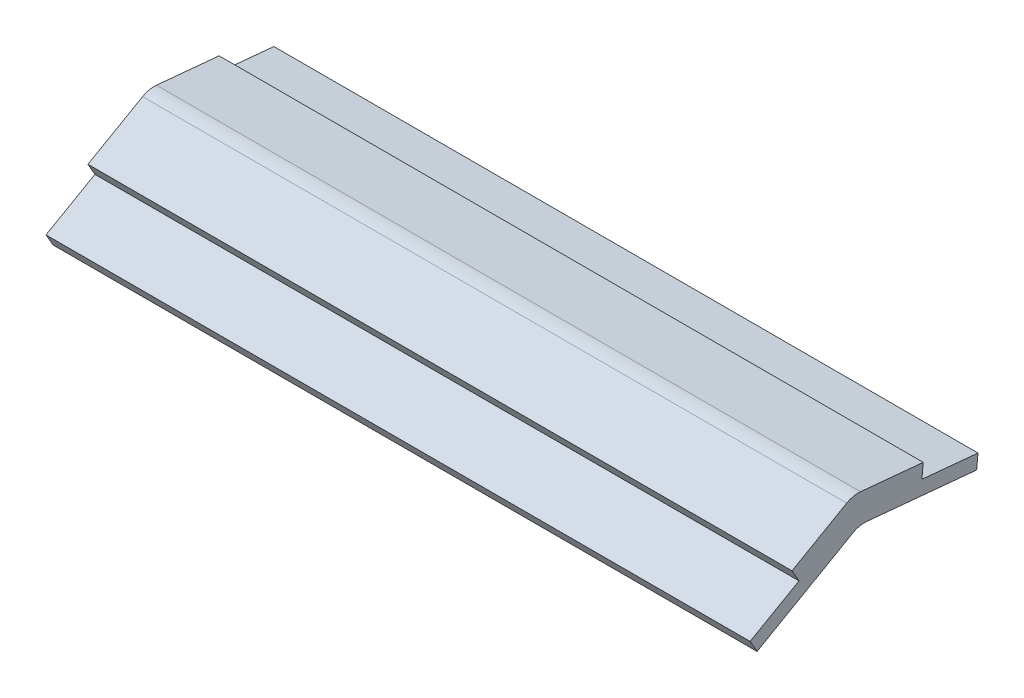
ISO-10303-21;
HEADER;
FILE_DESCRIPTION(('STEP AP214'),'2;1');
FILE_NAME('part.step','',(''),(''),'','','');
FILE_SCHEMA(('AUTOMOTIVE_DESIGN { 1 0 10303 214 1 1 1 1 }'));
ENDSEC;
DATA;
#1=APPLICATION_CONTEXT('core data for automotive mechanical design processes');
#2=APPLICATION_PROTOCOL_DEFINITION('international standard','automotive_design',2000,#1);
#3=PRODUCT_CONTEXT('',#1,'mechanical');
#4=PRODUCT('Part','Part','',(#3));
#5=PRODUCT_RELATED_PRODUCT_CATEGORY('part','',(#4));
#6=PRODUCT_DEFINITION_FORMATION('','',#4);
#7=PRODUCT_DEFINITION_CONTEXT('part definition',#1,'design');
#8=PRODUCT_DEFINITION('design','',#6,#7);
#9=PRODUCT_DEFINITION_SHAPE('','',#8);
#10=(LENGTH_UNIT() NAMED_UNIT(*) SI_UNIT(.MILLI.,.METRE.));
#11=(NAMED_UNIT(*) PLANE_ANGLE_UNIT() SI_UNIT($,.RADIAN.));
#12=(NAMED_UNIT(*) SI_UNIT($,.STERADIAN.) SOLID_ANGLE_UNIT());
#13=UNCERTAINTY_MEASURE_WITH_UNIT(LENGTH_MEASURE(1.E-05),#10,'distance_accuracy_value','');
#14=(GEOMETRIC_REPRESENTATION_CONTEXT(3) GLOBAL_UNCERTAINTY_ASSIGNED_CONTEXT((#13)) GLOBAL_UNIT_ASSIGNED_CONTEXT((#10,
#11,#12)) REPRESENTATION_CONTEXT('',''));
#15=CARTESIAN_POINT('',(0.,0.,0.));
#16=DIRECTION('',(0.,0.,1.));
#17=DIRECTION('',(1.,0.,0.));
#18=AXIS2_PLACEMENT_3D('',#15,#16,#17);
#19=CARTESIAN_POINT('',(150.,11.1634750678157,17.0367707480684));
#20=DIRECTION('',(0.,-0.868219876699294,-0.496179650634991));
#21=DIRECTION('',(0.,0.496179650634991,-0.868219876699294));
#22=AXIS2_PLACEMENT_3D('',#19,#20,#21);
#23=PLANE('',#22);
#24=DIRECTION('',(0.,-0.496179650634991,0.868219876699294));
#25=VECTOR('',#24,1.);
#26=CARTESIAN_POINT('',(0.,11.1634750678157,17.0367707480684));
#27=LINE('',#26,#25);
#28=CARTESIAN_POINT('',(0.,17.8204229852175,5.38837990285019));
#29=VERTEX_POINT('',#28);
#30=CARTESIAN_POINT('',(0.,11.1634750678157,17.0367707480684));
#31=VERTEX_POINT('',#30);
#32=EDGE_CURVE('E164',#29,#31,#27,.T.);
#33=ORIENTED_EDGE('',*,*,#32,.T.);
#34=DIRECTION('',(-1.,0.,0.));
#35=VECTOR('',#34,1.);
#36=CARTESIAN_POINT('',(150.,11.1634750678157,17.0367707480684));
#37=LINE('',#36,#35);
#38=CARTESIAN_POINT('',(150.,11.1634750678157,17.0367707480684));
#39=VERTEX_POINT('',#38);
#40=EDGE_CURVE('E11',#39,#31,#37,.T.);
#41=ORIENTED_EDGE('',*,*,#40,.F.);
#42=DIRECTION('',(0.,-0.496179650634991,0.868219876699294));
#43=VECTOR('',#42,1.);
#44=CARTESIAN_POINT('',(150.,11.1634750678157,17.0367707480684));
#45=LINE('',#44,#43);
#46=CARTESIAN_POINT('',(150.,17.8204229852175,5.38837990285019));
#47=VERTEX_POINT('',#46);
#48=EDGE_CURVE('E198',#47,#39,#45,.T.);
#49=ORIENTED_EDGE('',*,*,#48,.F.);
#50=DIRECTION('',(-1.,0.,0.));
#51=VECTOR('',#50,1.);
#52=CARTESIAN_POINT('',(150.,17.8204229852175,5.38837990285019));
#53=LINE('',#52,#51);
#54=EDGE_CURVE('E160',#47,#29,#53,.T.);
#55=ORIENTED_EDGE('',*,*,#54,.T.);
#56=EDGE_LOOP('',(#33,#41,#49,#55));
#57=FACE_BOUND('',#56,.T.);
#58=ADVANCED_FACE('F39',(#57),#23,.F.);
#59=CARTESIAN_POINT('',(150.,11.1634750678157,17.0367707480684));
#60=DIRECTION('',(0.,0.496179650634992,-0.868219876699294));
#61=DIRECTION('',(0.,0.868219876699294,0.496179650634992));
#62=AXIS2_PLACEMENT_3D('',#59,#60,#61);
#63=PLANE('',#62);
#64=DIRECTION('',(0.,-0.868219876699294,-0.496179650634992));
#65=VECTOR('',#64,1.);
#66=CARTESIAN_POINT('',(0.,11.1634750678157,17.0367707480684));
#67=LINE('',#66,#65);
#68=CARTESIAN_POINT('',(0.,8.55881543771778,15.5482317961635));
#69=VERTEX_POINT('',#68);
#70=EDGE_CURVE('E168',#31,#69,#67,.T.);
#71=ORIENTED_EDGE('',*,*,#70,.T.);
#72=DIRECTION('',(-1.,0.,0.));
#73=VECTOR('',#72,1.);
#74=CARTESIAN_POINT('',(150.,8.55881543771778,15.5482317961635));
#75=LINE('',#74,#73);
#76=CARTESIAN_POINT('',(150.,8.55881543771778,15.5482317961635));
#77=VERTEX_POINT('',#76);
#78=EDGE_CURVE('E48',#77,#69,#75,.T.);
#79=ORIENTED_EDGE('',*,*,#78,.F.);
#80=DIRECTION('',(0.,-0.868219876699294,-0.496179650634992));
#81=VECTOR('',#80,1.);
#82=CARTESIAN_POINT('',(150.,11.1634750678157,17.0367707480684));
#83=LINE('',#82,#81);
#84=EDGE_CURVE('E111',#39,#77,#83,.T.);
#85=ORIENTED_EDGE('',*,*,#84,.F.);
#86=ORIENTED_EDGE('',*,*,#40,.T.);
#87=EDGE_LOOP('',(#71,#79,#85,#86));
#88=FACE_BOUND('',#87,.T.);
#89=ADVANCED_FACE('F292',(#88),#63,.F.);
#90=CARTESIAN_POINT('',(150.,8.55881543771778,15.5482317961635));
#91=DIRECTION('',(0.,-0.868219876699294,-0.496179650634991));
#92=DIRECTION('',(0.,0.496179650634991,-0.868219876699294));
#93=AXIS2_PLACEMENT_3D('',#90,#91,#92);
#94=PLANE('',#93);
#95=DIRECTION('',(0.,-0.496179650634991,0.868219876699294));
#96=VECTOR('',#95,1.);
#97=CARTESIAN_POINT('',(0.,8.55881543771778,15.5482317961635));
#98=LINE('',#97,#96);
#99=CARTESIAN_POINT('',(0.,2.60465963009788,25.966870316555));
#100=VERTEX_POINT('',#99);
#101=EDGE_CURVE('E171',#69,#100,#98,.T.);
#102=ORIENTED_EDGE('',*,*,#101,.T.);
#103=DIRECTION('',(-1.,0.,0.));
#104=VECTOR('',#103,1.);
#105=CARTESIAN_POINT('',(150.,2.60465963009788,25.966870316555));
#106=LINE('',#105,#104);
#107=CARTESIAN_POINT('',(150.,2.60465963009788,25.966870316555));
#108=VERTEX_POINT('',#107);
#109=EDGE_CURVE('E225',#108,#100,#106,.T.);
#110=ORIENTED_EDGE('',*,*,#109,.F.);
#111=DIRECTION('',(0.,-0.496179650634991,0.868219876699294));
#112=VECTOR('',#111,1.);
#113=CARTESIAN_POINT('',(150.,8.55881543771778,15.5482317961635));
#114=LINE('',#113,#112);
#115=EDGE_CURVE('E235',#77,#108,#114,.T.);
#116=ORIENTED_EDGE('',*,*,#115,.F.);
#117=ORIENTED_EDGE('',*,*,#78,.T.);
#118=EDGE_LOOP('',(#102,#110,#116,#117));
#119=FACE_BOUND('',#118,.T.);
#120=ADVANCED_FACE('F233',(#119),#94,.F.);
#121=CARTESIAN_POINT('',(150.,2.60465963009788,25.966870316555));
#122=DIRECTION('',(0.,0.496179650634992,-0.868219876699294));
#123=DIRECTION('',(0.,0.868219876699294,0.496179650634992));
#124=AXIS2_PLACEMENT_3D('',#121,#122,#123);
#125=PLANE('',#124);
#126=DIRECTION('',(0.,-0.868219876699294,-0.496179650634992));
#127=VECTOR('',#126,1.);
#128=CARTESIAN_POINT('',(0.,2.60465963009788,25.966870316555));
#129=LINE('',#128,#127);
#130=CARTESIAN_POINT('',(0.,0.,24.47833136465));
#131=VERTEX_POINT('',#130);
#132=EDGE_CURVE('E174',#100,#131,#129,.T.);
#133=ORIENTED_EDGE('',*,*,#132,.T.);
#134=DIRECTION('',(-1.,0.,0.));
#135=VECTOR('',#134,1.);
#136=CARTESIAN_POINT('',(150.,0.,24.47833136465));
#137=LINE('',#136,#135);
#138=CARTESIAN_POINT('',(150.,0.,24.47833136465));
#139=VERTEX_POINT('',#138);
#140=EDGE_CURVE('E221',#139,#131,#137,.T.);
#141=ORIENTED_EDGE('',*,*,#140,.F.);
#142=DIRECTION('',(0.,-0.868219876699294,-0.496179650634992));
#143=VECTOR('',#142,1.);
#144=CARTESIAN_POINT('',(150.,2.60465963009788,25.966870316555));
#145=LINE('',#144,#143);
#146=EDGE_CURVE('E254',#108,#139,#145,.T.);
#147=ORIENTED_EDGE('',*,*,#146,.F.);
#148=ORIENTED_EDGE('',*,*,#109,.T.);
#149=EDGE_LOOP('',(#133,#141,#147,#148));
#150=FACE_BOUND('',#149,.T.);
#151=ADVANCED_FACE('F244',(#150),#125,.F.);
#152=CARTESIAN_POINT('',(150.,0.,24.47833136465));
#153=DIRECTION('',(0.,0.868219876699294,0.496179650634992));
#154=DIRECTION('',(0.,-0.496179650634992,0.868219876699294));
#155=AXIS2_PLACEMENT_3D('',#152,#153,#154);
#156=PLANE('',#155);
#157=DIRECTION('',(0.,0.496179650634992,-0.868219876699294));
#158=VECTOR('',#157,1.);
#159=CARTESIAN_POINT('',(0.,0.,24.47833136465));
#160=LINE('',#159,#158);
#161=CARTESIAN_POINT('',(0.,11.6681484979036,4.06129403312243));
#162=VERTEX_POINT('',#161);
#163=EDGE_CURVE('E177',#131,#162,#160,.T.);
#164=ORIENTED_EDGE('',*,*,#163,.T.);
#165=DIRECTION('',(-1.,0.,0.));
#166=VECTOR('',#165,1.);
#167=CARTESIAN_POINT('',(150.,11.6681484979036,4.06129403312243));
#168=LINE('',#167,#166);
#169=CARTESIAN_POINT('',(150.,11.6681484979036,4.06129403312243));
#170=VERTEX_POINT('',#169);
#171=EDGE_CURVE('E217',#170,#162,#168,.T.);
#172=ORIENTED_EDGE('',*,*,#171,.F.);
#173=DIRECTION('',(0.,0.496179650634992,-0.868219876699294));
#174=VECTOR('',#173,1.);
#175=CARTESIAN_POINT('',(150.,0.,24.47833136465));
#176=LINE('',#175,#174);
#177=EDGE_CURVE('E250',#139,#170,#176,.T.);
#178=ORIENTED_EDGE('',*,*,#177,.F.);
#179=ORIENTED_EDGE('',*,*,#140,.T.);
#180=EDGE_LOOP('',(#164,#172,#178,#179));
#181=FACE_BOUND('',#180,.T.);
#182=ADVANCED_FACE('F248',(#181),#156,.F.);
#183=CARTESIAN_POINT('',(150.,7.32704911440715,1.58039577994748));
#184=DIRECTION('',(-1.,0.,0.));
#185=DIRECTION('',(0.,0.,1.));
#186=AXIS2_PLACEMENT_3D('',#183,#184,#185);
#187=CYLINDRICAL_SURFACE('',#186,5.);
#188=CARTESIAN_POINT('',(0.,7.32704911440715,1.58039577994748));
#189=DIRECTION('',(-1.,0.,0.));
#190=DIRECTION('',(0.,0.,-1.));
#191=AXIS2_PLACEMENT_3D('',#188,#189,#190);
#192=CIRCLE('',#191,5.);
#193=CARTESIAN_POINT('',(0.,12.3048559190058,1.10982228293433));
#194=VERTEX_POINT('',#193);
#195=EDGE_CURVE('E180',#162,#194,#192,.T.);
#196=ORIENTED_EDGE('',*,*,#195,.T.);
#197=DIRECTION('',(-1.,0.,0.));
#198=VECTOR('',#197,1.);
#199=CARTESIAN_POINT('',(150.,12.3048559190058,1.10982228293433));
#200=LINE('',#199,#198);
#201=CARTESIAN_POINT('',(150.,12.3048559190058,1.10982228293433));
#202=VERTEX_POINT('',#201);
#203=EDGE_CURVE('E213',#202,#194,#200,.T.);
#204=ORIENTED_EDGE('',*,*,#203,.F.);
#205=CARTESIAN_POINT('',(150.,7.32704911440715,1.58039577994748));
#206=DIRECTION('',(-1.,0.,0.));
#207=DIRECTION('',(0.,0.,-1.));
#208=AXIS2_PLACEMENT_3D('',#205,#206,#207);
#209=CIRCLE('',#208,5.);
#210=EDGE_CURVE('E253',#170,#202,#209,.T.);
#211=ORIENTED_EDGE('',*,*,#210,.F.);
#212=ORIENTED_EDGE('',*,*,#171,.T.);
#213=EDGE_LOOP('',(#196,#204,#211,#212));
#214=FACE_BOUND('',#213,.T.);
#215=ADVANCED_FACE('F305',(#214),#187,.F.);
#216=CARTESIAN_POINT('',(150.,12.3048559190058,1.10982228293433));
#217=DIRECTION('',(0.,0.995561360919734,-0.0941146994026286));
#218=DIRECTION('',(0.,0.0941146994026287,0.995561360919734));
#219=AXIS2_PLACEMENT_3D('',#216,#217,#218);
#220=PLANE('',#219);
#221=DIRECTION('',(0.,-0.0941146994026286,-0.995561360919734));
#222=VECTOR('',#221,1.);
#223=CARTESIAN_POINT('',(0.,12.3048559190058,1.10982228293433));
#224=LINE('',#223,#222);
#225=CARTESIAN_POINT('',(0.,10.0916382193632,-22.3019724638309));
#226=VERTEX_POINT('',#225);
#227=EDGE_CURVE('E183',#194,#226,#224,.T.);
#228=ORIENTED_EDGE('',*,*,#227,.T.);
#229=DIRECTION('',(-1.,0.,0.));
#230=VECTOR('',#229,1.);
#231=CARTESIAN_POINT('',(150.,10.0916382193632,-22.3019724638309));
#232=LINE('',#231,#230);
#233=CARTESIAN_POINT('',(150.,10.0916382193632,-22.3019724638309));
#234=VERTEX_POINT('',#233);
#235=EDGE_CURVE('E209',#234,#226,#232,.T.);
#236=ORIENTED_EDGE('',*,*,#235,.F.);
#237=DIRECTION('',(0.,-0.0941146994026286,-0.995561360919734));
#238=VECTOR('',#237,1.);
#239=CARTESIAN_POINT('',(150.,12.3048559190058,1.10982228293433));
#240=LINE('',#239,#238);
#241=EDGE_CURVE('E258',#202,#234,#240,.T.);
#242=ORIENTED_EDGE('',*,*,#241,.F.);
#243=ORIENTED_EDGE('',*,*,#203,.T.);
#244=EDGE_LOOP('',(#228,#236,#242,#243));
#245=FACE_BOUND('',#244,.T.);
#246=ADVANCED_FACE('F308',(#245),#220,.F.);
#247=CARTESIAN_POINT('',(150.,13.0783223021224,-22.5843165620387));
#248=DIRECTION('',(0.,0.0941146994026289,0.995561360919734));
#249=DIRECTION('',(0.,-0.995561360919734,0.0941146994026289));
#250=AXIS2_PLACEMENT_3D('',#247,#248,#249);
#251=PLANE('',#250);
#252=DIRECTION('',(0.,0.995561360919734,-0.0941146994026288));
#253=VECTOR('',#252,1.);
#254=CARTESIAN_POINT('',(0.,13.0783223021224,-22.5843165620387));
#255=LINE('',#254,#253);
#256=CARTESIAN_POINT('',(0.,13.0783223021224,-22.5843165620387));
#257=VERTEX_POINT('',#256);
#258=EDGE_CURVE('E186',#226,#257,#255,.T.);
#259=ORIENTED_EDGE('',*,*,#258,.T.);
#260=DIRECTION('',(-1.,0.,0.));
#261=VECTOR('',#260,1.);
#262=CARTESIAN_POINT('',(150.,13.0783223021224,-22.5843165620387));
#263=LINE('',#262,#261);
#264=CARTESIAN_POINT('',(150.,13.0783223021224,-22.5843165620387));
#265=VERTEX_POINT('',#264);
#266=EDGE_CURVE('E205',#265,#257,#263,.T.);
#267=ORIENTED_EDGE('',*,*,#266,.F.);
#268=DIRECTION('',(0.,0.995561360919734,-0.0941146994026288));
#269=VECTOR('',#268,1.);
#270=CARTESIAN_POINT('',(150.,13.0783223021224,-22.5843165620387));
#271=LINE('',#270,#269);
#272=EDGE_CURVE('E265',#234,#265,#271,.T.);
#273=ORIENTED_EDGE('',*,*,#272,.F.);
#274=ORIENTED_EDGE('',*,*,#235,.T.);
#275=EDGE_LOOP('',(#259,#267,#273,#274));
#276=FACE_BOUND('',#275,.T.);
#277=ADVANCED_FACE('F273',(#276),#251,.F.);
#278=CARTESIAN_POINT('',(150.,14.2077668646855,-10.6375866755762));
#279=DIRECTION('',(0.,-0.995560823871876,0.0941203802135896));
#280=DIRECTION('',(0.,-0.0941203802135896,-0.995560823871876));
#281=AXIS2_PLACEMENT_3D('',#278,#279,#280);
#282=PLANE('',#281);
#283=DIRECTION('',(0.,0.0941203802135896,0.995560823871876));
#284=VECTOR('',#283,1.);
#285=CARTESIAN_POINT('',(0.,14.2077668646855,-10.6375866755762));
#286=LINE('',#285,#284);
#287=CARTESIAN_POINT('',(0.,14.2077668646855,-10.6375866755762));
#288=VERTEX_POINT('',#287);
#289=EDGE_CURVE('E189',#257,#288,#286,.T.);
#290=ORIENTED_EDGE('',*,*,#289,.T.);
#291=DIRECTION('',(-1.,0.,0.));
#292=VECTOR('',#291,1.);
#293=CARTESIAN_POINT('',(150.,14.2077668646855,-10.6375866755762));
#294=LINE('',#293,#292);
#295=CARTESIAN_POINT('',(150.,14.2077668646855,-10.6375866755762));
#296=VERTEX_POINT('',#295);
#297=EDGE_CURVE('E153',#296,#288,#294,.T.);
#298=ORIENTED_EDGE('',*,*,#297,.F.);
#299=DIRECTION('',(0.,0.0941203802135896,0.995560823871876));
#300=VECTOR('',#299,1.);
#301=CARTESIAN_POINT('',(150.,14.2077668646855,-10.6375866755762));
#302=LINE('',#301,#300);
#303=EDGE_CURVE('E142',#265,#296,#302,.T.);
#304=ORIENTED_EDGE('',*,*,#303,.F.);
#305=ORIENTED_EDGE('',*,*,#266,.T.);
#306=EDGE_LOOP('',(#290,#298,#304,#305));
#307=FACE_BOUND('',#306,.T.);
#308=ADVANCED_FACE('F277',(#307),#282,.F.);
#309=CARTESIAN_POINT('',(150.,17.1944493363011,-10.919947816217));
#310=DIRECTION('',(0.,0.0941203802135861,0.995560823871877));
#311=DIRECTION('',(0.,-0.995560823871877,0.0941203802135861));
#312=AXIS2_PLACEMENT_3D('',#309,#310,#311);
#313=PLANE('',#312);
#314=DIRECTION('',(0.,0.995560823871877,-0.0941203802135861));
#315=VECTOR('',#314,1.);
#316=CARTESIAN_POINT('',(0.,17.1944493363011,-10.919947816217));
#317=LINE('',#316,#315);
#318=CARTESIAN_POINT('',(0.,17.1944493363011,-10.919947816217));
#319=VERTEX_POINT('',#318);
#320=EDGE_CURVE('E151',#288,#319,#317,.T.);
#321=ORIENTED_EDGE('',*,*,#320,.T.);
#322=DIRECTION('',(-1.,0.,0.));
#323=VECTOR('',#322,1.);
#324=CARTESIAN_POINT('',(150.,17.1944493363011,-10.919947816217));
#325=LINE('',#324,#323);
#326=CARTESIAN_POINT('',(150.,17.1944493363011,-10.919947816217));
#327=VERTEX_POINT('',#326);
#328=EDGE_CURVE('E148',#327,#319,#325,.T.);
#329=ORIENTED_EDGE('',*,*,#328,.F.);
#330=DIRECTION('',(0.,0.995560823871877,-0.0941203802135861));
#331=VECTOR('',#330,1.);
#332=CARTESIAN_POINT('',(150.,17.1944493363011,-10.919947816217));
#333=LINE('',#332,#331);
#334=EDGE_CURVE('E136',#296,#327,#333,.T.);
#335=ORIENTED_EDGE('',*,*,#334,.F.);
#336=ORIENTED_EDGE('',*,*,#297,.T.);
#337=EDGE_LOOP('',(#321,#329,#335,#336));
#338=FACE_BOUND('',#337,.T.);
#339=ADVANCED_FACE('F149',(#338),#313,.F.);
#340=CARTESIAN_POINT('',(150.,18.4571304063197,2.43690815266209));
#341=DIRECTION('',(0.,-0.995561360919734,0.0941146994026288));
#342=DIRECTION('',(0.,-0.0941146994026288,-0.995561360919734));
#343=AXIS2_PLACEMENT_3D('',#340,#341,#342);
#344=PLANE('',#343);
#345=DIRECTION('',(0.,0.0941146994026288,0.995561360919734));
#346=VECTOR('',#345,1.);
#347=CARTESIAN_POINT('',(0.,18.4571304063197,2.43690815266209));
#348=LINE('',#347,#346);
#349=CARTESIAN_POINT('',(0.,18.4571304063197,2.43690815266209));
#350=VERTEX_POINT('',#349);
#351=EDGE_CURVE('E97',#319,#350,#348,.T.);
#352=ORIENTED_EDGE('',*,*,#351,.T.);
#353=DIRECTION('',(-1.,0.,0.));
#354=VECTOR('',#353,1.);
#355=CARTESIAN_POINT('',(150.,18.4571304063197,2.43690815266209));
#356=LINE('',#355,#354);
#357=CARTESIAN_POINT('',(150.,18.4571304063197,2.43690815266209));
#358=VERTEX_POINT('',#357);
#359=EDGE_CURVE('E154',#358,#350,#356,.T.);
#360=ORIENTED_EDGE('',*,*,#359,.F.);
#361=DIRECTION('',(0.,0.0941146994026288,0.995561360919734));
#362=VECTOR('',#361,1.);
#363=CARTESIAN_POINT('',(150.,18.4571304063197,2.43690815266209));
#364=LINE('',#363,#362);
#365=EDGE_CURVE('E140',#327,#358,#364,.T.);
#366=ORIENTED_EDGE('',*,*,#365,.F.);
#367=ORIENTED_EDGE('',*,*,#328,.T.);
#368=EDGE_LOOP('',(#352,#360,#366,#367));
#369=FACE_BOUND('',#368,.T.);
#370=ADVANCED_FACE('F156',(#369),#344,.F.);
#371=CARTESIAN_POINT('',(150.,13.479323601721,2.90748164967523));
#372=DIRECTION('',(-1.,0.,0.));
#373=DIRECTION('',(0.,0.,1.));
#374=AXIS2_PLACEMENT_3D('',#371,#372,#373);
#375=CYLINDRICAL_SURFACE('',#374,5.);
#376=CARTESIAN_POINT('',(0.,13.479323601721,2.90748164967523));
#377=DIRECTION('',(1.,0.,0.));
#378=DIRECTION('',(0.,0.,-1.));
#379=AXIS2_PLACEMENT_3D('',#376,#377,#378);
#380=CIRCLE('',#379,5.);
#381=EDGE_CURVE('E103',#350,#29,#380,.T.);
#382=ORIENTED_EDGE('',*,*,#381,.T.);
#383=ORIENTED_EDGE('',*,*,#54,.F.);
#384=CARTESIAN_POINT('',(150.,13.479323601721,2.90748164967523));
#385=DIRECTION('',(1.,0.,0.));
#386=DIRECTION('',(0.,0.,-1.));
#387=AXIS2_PLACEMENT_3D('',#384,#385,#386);
#388=CIRCLE('',#387,5.);
#389=EDGE_CURVE('E56',#358,#47,#388,.T.);
#390=ORIENTED_EDGE('',*,*,#389,.F.);
#391=ORIENTED_EDGE('',*,*,#359,.T.);
#392=EDGE_LOOP('',(#382,#383,#390,#391));
#393=FACE_BOUND('',#392,.T.);
#394=ADVANCED_FACE('F281',(#393),#375,.T.);
#395=CARTESIAN_POINT('',(150.,13.479323601721,2.90748164967523));
#396=DIRECTION('',(1.,0.,0.));
#397=DIRECTION('',(0.,0.,-1.));
#398=AXIS2_PLACEMENT_3D('',#395,#396,#397);
#399=PLANE('',#398);
#400=ORIENTED_EDGE('',*,*,#48,.T.);
#401=ORIENTED_EDGE('',*,*,#84,.T.);
#402=ORIENTED_EDGE('',*,*,#115,.T.);
#403=ORIENTED_EDGE('',*,*,#146,.T.);
#404=ORIENTED_EDGE('',*,*,#177,.T.);
#405=ORIENTED_EDGE('',*,*,#210,.T.);
#406=ORIENTED_EDGE('',*,*,#241,.T.);
#407=ORIENTED_EDGE('',*,*,#272,.T.);
#408=ORIENTED_EDGE('',*,*,#303,.T.);
#409=ORIENTED_EDGE('',*,*,#334,.T.);
#410=ORIENTED_EDGE('',*,*,#365,.T.);
#411=ORIENTED_EDGE('',*,*,#389,.T.);
#412=EDGE_LOOP('',(#400,#401,#402,#403,#404,#405,#406,#407,#408,#409,#410,#411));
#413=FACE_BOUND('',#412,.T.);
#414=ADVANCED_FACE('F138',(#413),#399,.T.);
#415=CARTESIAN_POINT('',(0.,13.479323601721,2.90748164967523));
#416=DIRECTION('',(1.,0.,0.));
#417=DIRECTION('',(0.,0.,-1.));
#418=AXIS2_PLACEMENT_3D('',#415,#416,#417);
#419=PLANE('',#418);
#420=ORIENTED_EDGE('',*,*,#32,.F.);
#421=ORIENTED_EDGE('',*,*,#381,.F.);
#422=ORIENTED_EDGE('',*,*,#351,.F.);
#423=ORIENTED_EDGE('',*,*,#320,.F.);
#424=ORIENTED_EDGE('',*,*,#289,.F.);
#425=ORIENTED_EDGE('',*,*,#258,.F.);
#426=ORIENTED_EDGE('',*,*,#227,.F.);
#427=ORIENTED_EDGE('',*,*,#195,.F.);
#428=ORIENTED_EDGE('',*,*,#163,.F.);
#429=ORIENTED_EDGE('',*,*,#132,.F.);
#430=ORIENTED_EDGE('',*,*,#101,.F.);
#431=ORIENTED_EDGE('',*,*,#70,.F.);
#432=EDGE_LOOP('',(#420,#421,#422,#423,#424,#425,#426,#427,#428,#429,#430,#431));
#433=FACE_BOUND('',#432,.T.);
#434=ADVANCED_FACE('F239',(#433),#419,.F.);
#435=CLOSED_SHELL('',(#58,#89,#120,#151,#182,#215,#246,#277,#308,#339,#370,#394,#414,#434));
#436=MANIFOLD_SOLID_BREP('B2',#435);
#437=ADVANCED_BREP_SHAPE_REPRESENTATION('',(#18,#436),#14);
#438=SHAPE_DEFINITION_REPRESENTATION(#9,#437);
ENDSEC;
END-ISO-10303-21;
